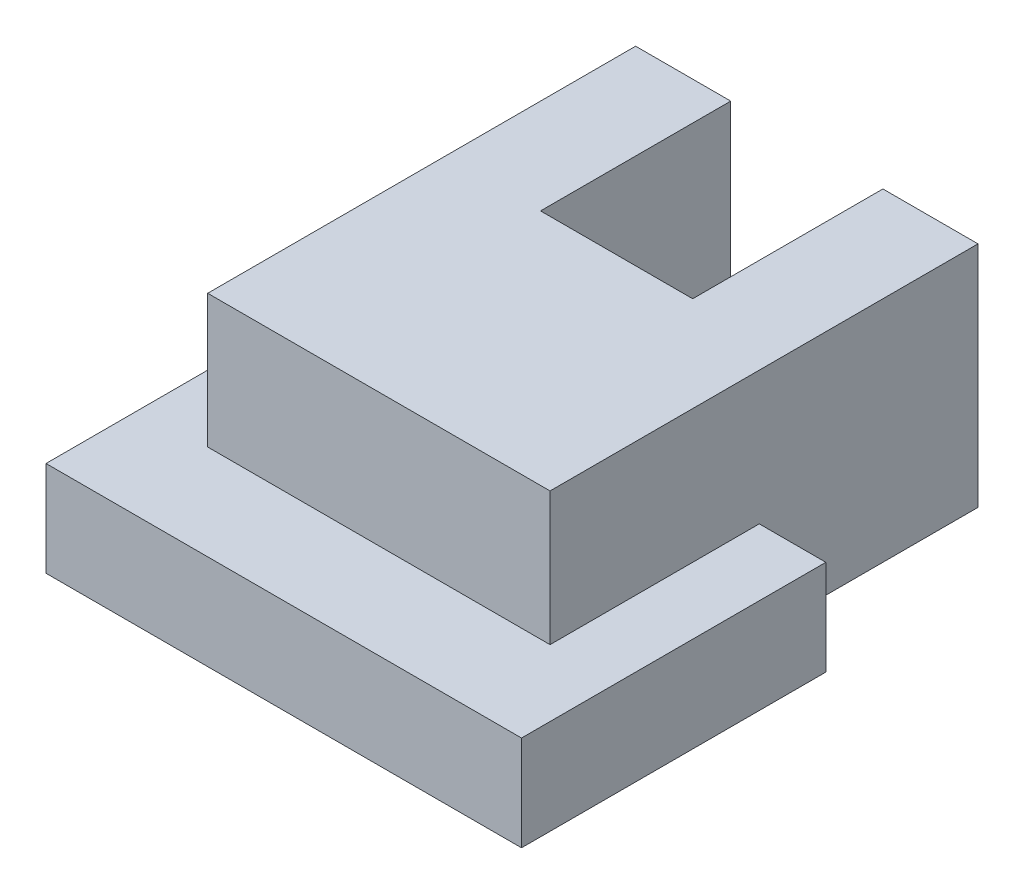
ISO-10303-21;
HEADER;
FILE_DESCRIPTION(('STEP AP214'),'2;1');
FILE_NAME('part.step','',(''),(''),'','','');
FILE_SCHEMA(('AUTOMOTIVE_DESIGN { 1 0 10303 214 1 1 1 1 }'));
ENDSEC;
DATA;
#1=APPLICATION_CONTEXT('core data for automotive mechanical design processes');
#2=APPLICATION_PROTOCOL_DEFINITION('international standard','automotive_design',2000,#1);
#3=PRODUCT_CONTEXT('',#1,'mechanical');
#4=PRODUCT('Part','Part','',(#3));
#5=PRODUCT_RELATED_PRODUCT_CATEGORY('part','',(#4));
#6=PRODUCT_DEFINITION_FORMATION('','',#4);
#7=PRODUCT_DEFINITION_CONTEXT('part definition',#1,'design');
#8=PRODUCT_DEFINITION('design','',#6,#7);
#9=PRODUCT_DEFINITION_SHAPE('','',#8);
#10=(LENGTH_UNIT() NAMED_UNIT(*) SI_UNIT(.MILLI.,.METRE.));
#11=(NAMED_UNIT(*) PLANE_ANGLE_UNIT() SI_UNIT($,.RADIAN.));
#12=(NAMED_UNIT(*) SI_UNIT($,.STERADIAN.) SOLID_ANGLE_UNIT());
#13=UNCERTAINTY_MEASURE_WITH_UNIT(LENGTH_MEASURE(1.E-05),#10,'distance_accuracy_value','');
#14=(GEOMETRIC_REPRESENTATION_CONTEXT(3) GLOBAL_UNCERTAINTY_ASSIGNED_CONTEXT((#13)) GLOBAL_UNIT_ASSIGNED_CONTEXT((#10,
#11,#12)) REPRESENTATION_CONTEXT('',''));
#15=CARTESIAN_POINT('',(0.,0.,0.));
#16=DIRECTION('',(0.,0.,1.));
#17=DIRECTION('',(1.,0.,0.));
#18=AXIS2_PLACEMENT_3D('',#15,#16,#17);
#19=CARTESIAN_POINT('',(-25.,10.,-16.));
#20=DIRECTION('',(0.,0.,1.));
#21=DIRECTION('',(1.,0.,0.));
#22=AXIS2_PLACEMENT_3D('',#19,#20,#21);
#23=PLANE('',#22);
#24=DIRECTION('',(-1.,0.,0.));
#25=VECTOR('',#24,1.);
#26=CARTESIAN_POINT('',(-25.,10.,-16.));
#27=LINE('',#26,#25);
#28=CARTESIAN_POINT('',(-18.,10.,-16.));
#29=VERTEX_POINT('',#28);
#30=CARTESIAN_POINT('',(-25.,10.,-16.));
#31=VERTEX_POINT('',#30);
#32=EDGE_CURVE('E230',#29,#31,#27,.T.);
#33=ORIENTED_EDGE('',*,*,#32,.F.);
#34=DIRECTION('',(0.,-1.,0.));
#35=VECTOR('',#34,1.);
#36=CARTESIAN_POINT('',(-18.,10.,-16.));
#37=LINE('',#36,#35);
#38=CARTESIAN_POINT('',(-18.,0.,-16.));
#39=VERTEX_POINT('',#38);
#40=EDGE_CURVE('E224',#29,#39,#37,.T.);
#41=ORIENTED_EDGE('',*,*,#40,.T.);
#42=DIRECTION('',(-1.,0.,0.));
#43=VECTOR('',#42,1.);
#44=CARTESIAN_POINT('',(-25.,0.,-16.));
#45=LINE('',#44,#43);
#46=CARTESIAN_POINT('',(-25.,0.,-16.));
#47=VERTEX_POINT('',#46);
#48=EDGE_CURVE('E238',#39,#47,#45,.T.);
#49=ORIENTED_EDGE('',*,*,#48,.T.);
#50=DIRECTION('',(0.,-1.,0.));
#51=VECTOR('',#50,1.);
#52=CARTESIAN_POINT('',(-25.,10.,-16.));
#53=LINE('',#52,#51);
#54=EDGE_CURVE('E45',#31,#47,#53,.T.);
#55=ORIENTED_EDGE('',*,*,#54,.F.);
#56=EDGE_LOOP('',(#33,#41,#49,#55));
#57=FACE_BOUND('',#56,.T.);
#58=ADVANCED_FACE('F37',(#57),#23,.F.);
#59=CARTESIAN_POINT('',(25.,10.,16.));
#60=DIRECTION('',(-1.,0.,0.));
#61=DIRECTION('',(0.,0.,1.));
#62=AXIS2_PLACEMENT_3D('',#59,#60,#61);
#63=PLANE('',#62);
#64=DIRECTION('',(0.,0.,-1.));
#65=VECTOR('',#64,1.);
#66=CARTESIAN_POINT('',(25.,0.,16.));
#67=LINE('',#66,#65);
#68=CARTESIAN_POINT('',(25.,0.,16.));
#69=VERTEX_POINT('',#68);
#70=CARTESIAN_POINT('',(25.,0.,-16.));
#71=VERTEX_POINT('',#70);
#72=EDGE_CURVE('E227',#69,#71,#67,.T.);
#73=ORIENTED_EDGE('',*,*,#72,.T.);
#74=DIRECTION('',(0.,-1.,0.));
#75=VECTOR('',#74,1.);
#76=CARTESIAN_POINT('',(25.,10.,-16.));
#77=LINE('',#76,#75);
#78=CARTESIAN_POINT('',(25.,10.,-16.));
#79=VERTEX_POINT('',#78);
#80=EDGE_CURVE('E11',#79,#71,#77,.T.);
#81=ORIENTED_EDGE('',*,*,#80,.F.);
#82=DIRECTION('',(0.,0.,-1.));
#83=VECTOR('',#82,1.);
#84=CARTESIAN_POINT('',(25.,10.,16.));
#85=LINE('',#84,#83);
#86=CARTESIAN_POINT('',(25.,10.,16.));
#87=VERTEX_POINT('',#86);
#88=EDGE_CURVE('E228',#87,#79,#85,.T.);
#89=ORIENTED_EDGE('',*,*,#88,.F.);
#90=DIRECTION('',(0.,-1.,0.));
#91=VECTOR('',#90,1.);
#92=CARTESIAN_POINT('',(25.,10.,16.));
#93=LINE('',#92,#91);
#94=EDGE_CURVE('E235',#87,#69,#93,.T.);
#95=ORIENTED_EDGE('',*,*,#94,.T.);
#96=EDGE_LOOP('',(#73,#81,#89,#95));
#97=FACE_BOUND('',#96,.T.);
#98=ADVANCED_FACE('F39',(#97),#63,.F.);
#99=CARTESIAN_POINT('',(18.,0.,-16.));
#100=VERTEX_POINT('',#99);
#101=EDGE_CURVE('E239',#71,#100,#45,.T.);
#102=ORIENTED_EDGE('',*,*,#101,.T.);
#103=DIRECTION('',(0.,1.,0.));
#104=VECTOR('',#103,1.);
#105=CARTESIAN_POINT('',(18.,10.,-16.));
#106=LINE('',#105,#104);
#107=CARTESIAN_POINT('',(18.,10.,-16.));
#108=VERTEX_POINT('',#107);
#109=EDGE_CURVE('E221',#100,#108,#106,.T.);
#110=ORIENTED_EDGE('',*,*,#109,.T.);
#111=EDGE_CURVE('E89',#79,#108,#27,.T.);
#112=ORIENTED_EDGE('',*,*,#111,.F.);
#113=ORIENTED_EDGE('',*,*,#80,.T.);
#114=EDGE_LOOP('',(#102,#110,#112,#113));
#115=FACE_BOUND('',#114,.T.);
#116=ADVANCED_FACE('F274',(#115),#23,.F.);
#117=CARTESIAN_POINT('',(-25.,10.,16.));
#118=DIRECTION('',(1.,0.,0.));
#119=DIRECTION('',(0.,0.,-1.));
#120=AXIS2_PLACEMENT_3D('',#117,#118,#119);
#121=PLANE('',#120);
#122=DIRECTION('',(0.,0.,1.));
#123=VECTOR('',#122,1.);
#124=CARTESIAN_POINT('',(-25.,0.,16.));
#125=LINE('',#124,#123);
#126=CARTESIAN_POINT('',(-25.,0.,16.));
#127=VERTEX_POINT('',#126);
#128=EDGE_CURVE('E242',#47,#127,#125,.T.);
#129=ORIENTED_EDGE('',*,*,#128,.T.);
#130=DIRECTION('',(0.,-1.,0.));
#131=VECTOR('',#130,1.);
#132=CARTESIAN_POINT('',(-25.,10.,16.));
#133=LINE('',#132,#131);
#134=CARTESIAN_POINT('',(-25.,10.,16.));
#135=VERTEX_POINT('',#134);
#136=EDGE_CURVE('E246',#135,#127,#133,.T.);
#137=ORIENTED_EDGE('',*,*,#136,.F.);
#138=DIRECTION('',(0.,0.,1.));
#139=VECTOR('',#138,1.);
#140=CARTESIAN_POINT('',(-25.,10.,16.));
#141=LINE('',#140,#139);
#142=EDGE_CURVE('E232',#31,#135,#141,.T.);
#143=ORIENTED_EDGE('',*,*,#142,.F.);
#144=ORIENTED_EDGE('',*,*,#54,.T.);
#145=EDGE_LOOP('',(#129,#137,#143,#144));
#146=FACE_BOUND('',#145,.T.);
#147=ADVANCED_FACE('F252',(#146),#121,.F.);
#148=CARTESIAN_POINT('',(-25.,10.,16.));
#149=DIRECTION('',(0.,0.,-1.));
#150=DIRECTION('',(-1.,0.,0.));
#151=AXIS2_PLACEMENT_3D('',#148,#149,#150);
#152=PLANE('',#151);
#153=DIRECTION('',(1.,0.,0.));
#154=VECTOR('',#153,1.);
#155=CARTESIAN_POINT('',(-25.,0.,16.));
#156=LINE('',#155,#154);
#157=EDGE_CURVE('E82',#127,#69,#156,.T.);
#158=ORIENTED_EDGE('',*,*,#157,.T.);
#159=ORIENTED_EDGE('',*,*,#94,.F.);
#160=DIRECTION('',(1.,0.,0.));
#161=VECTOR('',#160,1.);
#162=CARTESIAN_POINT('',(-25.,10.,16.));
#163=LINE('',#162,#161);
#164=EDGE_CURVE('E61',#135,#87,#163,.T.);
#165=ORIENTED_EDGE('',*,*,#164,.F.);
#166=ORIENTED_EDGE('',*,*,#136,.T.);
#167=EDGE_LOOP('',(#158,#159,#165,#166));
#168=FACE_BOUND('',#167,.T.);
#169=ADVANCED_FACE('F265',(#168),#152,.F.);
#170=CARTESIAN_POINT('',(0.,10.,0.));
#171=DIRECTION('',(0.,-1.,0.));
#172=DIRECTION('',(0.,0.,-1.));
#173=AXIS2_PLACEMENT_3D('',#170,#171,#172);
#174=PLANE('',#173);
#175=DIRECTION('',(-1.,0.,0.));
#176=VECTOR('',#175,1.);
#177=CARTESIAN_POINT('',(0.,10.,6.));
#178=LINE('',#177,#176);
#179=CARTESIAN_POINT('',(18.,10.,6.));
#180=VERTEX_POINT('',#179);
#181=CARTESIAN_POINT('',(-18.,10.,6.));
#182=VERTEX_POINT('',#181);
#183=EDGE_CURVE('E205',#180,#182,#178,.T.);
#184=ORIENTED_EDGE('',*,*,#183,.T.);
#185=DIRECTION('',(0.,0.,-1.));
#186=VECTOR('',#185,1.);
#187=CARTESIAN_POINT('',(-18.,10.,0.));
#188=LINE('',#187,#186);
#189=EDGE_CURVE('E151',#182,#29,#188,.T.);
#190=ORIENTED_EDGE('',*,*,#189,.T.);
#191=ORIENTED_EDGE('',*,*,#32,.T.);
#192=ORIENTED_EDGE('',*,*,#142,.T.);
#193=ORIENTED_EDGE('',*,*,#164,.T.);
#194=ORIENTED_EDGE('',*,*,#88,.T.);
#195=ORIENTED_EDGE('',*,*,#111,.T.);
#196=DIRECTION('',(0.,0.,1.));
#197=VECTOR('',#196,1.);
#198=CARTESIAN_POINT('',(18.,10.,0.));
#199=LINE('',#198,#197);
#200=EDGE_CURVE('E218',#108,#180,#199,.T.);
#201=ORIENTED_EDGE('',*,*,#200,.T.);
#202=EDGE_LOOP('',(#184,#190,#191,#192,#193,#194,#195,#201));
#203=FACE_BOUND('',#202,.T.);
#204=ADVANCED_FACE('F267',(#203),#174,.F.);
#205=CARTESIAN_POINT('',(0.,0.,0.));
#206=DIRECTION('',(0.,-1.,0.));
#207=DIRECTION('',(0.,0.,-1.));
#208=AXIS2_PLACEMENT_3D('',#205,#206,#207);
#209=PLANE('',#208);
#210=ORIENTED_EDGE('',*,*,#48,.F.);
#211=DIRECTION('',(0.,0.,1.));
#212=VECTOR('',#211,1.);
#213=CARTESIAN_POINT('',(-18.,0.,6.));
#214=LINE('',#213,#212);
#215=CARTESIAN_POINT('',(-18.,0.,-39.));
#216=VERTEX_POINT('',#215);
#217=EDGE_CURVE('E185',#216,#39,#214,.T.);
#218=ORIENTED_EDGE('',*,*,#217,.F.);
#219=DIRECTION('',(-1.,0.,0.));
#220=VECTOR('',#219,1.);
#221=CARTESIAN_POINT('',(-18.,0.,-39.));
#222=LINE('',#221,#220);
#223=CARTESIAN_POINT('',(-7.99999999999999,0.,-39.));
#224=VERTEX_POINT('',#223);
#225=EDGE_CURVE('E154',#224,#216,#222,.T.);
#226=ORIENTED_EDGE('',*,*,#225,.F.);
#227=DIRECTION('',(0.,0.,-1.));
#228=VECTOR('',#227,1.);
#229=CARTESIAN_POINT('',(-7.99999999999999,0.,-39.));
#230=LINE('',#229,#228);
#231=CARTESIAN_POINT('',(-8.,0.,-19.));
#232=VERTEX_POINT('',#231);
#233=EDGE_CURVE('E198',#232,#224,#230,.T.);
#234=ORIENTED_EDGE('',*,*,#233,.F.);
#235=DIRECTION('',(-1.,0.,0.));
#236=VECTOR('',#235,1.);
#237=CARTESIAN_POINT('',(-8.,0.,-19.));
#238=LINE('',#237,#236);
#239=CARTESIAN_POINT('',(8.,0.,-19.));
#240=VERTEX_POINT('',#239);
#241=EDGE_CURVE('E195',#240,#232,#238,.T.);
#242=ORIENTED_EDGE('',*,*,#241,.F.);
#243=DIRECTION('',(0.,0.,1.));
#244=VECTOR('',#243,1.);
#245=CARTESIAN_POINT('',(7.99999999999999,0.,-39.));
#246=LINE('',#245,#244);
#247=CARTESIAN_POINT('',(7.99999999999999,0.,-39.));
#248=VERTEX_POINT('',#247);
#249=EDGE_CURVE('E192',#248,#240,#246,.T.);
#250=ORIENTED_EDGE('',*,*,#249,.F.);
#251=DIRECTION('',(-1.,0.,0.));
#252=VECTOR('',#251,1.);
#253=CARTESIAN_POINT('',(7.99999999999999,0.,-39.));
#254=LINE('',#253,#252);
#255=CARTESIAN_POINT('',(18.,0.,-39.));
#256=VERTEX_POINT('',#255);
#257=EDGE_CURVE('E189',#256,#248,#254,.T.);
#258=ORIENTED_EDGE('',*,*,#257,.F.);
#259=DIRECTION('',(0.,0.,-1.));
#260=VECTOR('',#259,1.);
#261=CARTESIAN_POINT('',(18.,0.,6.));
#262=LINE('',#261,#260);
#263=EDGE_CURVE('E187',#100,#256,#262,.T.);
#264=ORIENTED_EDGE('',*,*,#263,.F.);
#265=ORIENTED_EDGE('',*,*,#101,.F.);
#266=ORIENTED_EDGE('',*,*,#72,.F.);
#267=ORIENTED_EDGE('',*,*,#157,.F.);
#268=ORIENTED_EDGE('',*,*,#128,.F.);
#269=EDGE_LOOP('',(#210,#218,#226,#234,#242,#250,#258,#264,#265,#266,#267,#268));
#270=FACE_BOUND('',#269,.T.);
#271=ADVANCED_FACE('F258',(#270),#209,.T.);
#272=CARTESIAN_POINT('',(-18.,0.,6.));
#273=DIRECTION('',(-1.,0.,0.));
#274=DIRECTION('',(0.,0.,1.));
#275=AXIS2_PLACEMENT_3D('',#272,#273,#274);
#276=PLANE('',#275);
#277=ORIENTED_EDGE('',*,*,#40,.F.);
#278=ORIENTED_EDGE('',*,*,#189,.F.);
#279=DIRECTION('',(0.,1.,0.));
#280=VECTOR('',#279,1.);
#281=CARTESIAN_POINT('',(-18.,0.,6.));
#282=LINE('',#281,#280);
#283=CARTESIAN_POINT('',(-18.,24.,6.));
#284=VERTEX_POINT('',#283);
#285=EDGE_CURVE('E52',#182,#284,#282,.T.);
#286=ORIENTED_EDGE('',*,*,#285,.T.);
#287=DIRECTION('',(0.,0.,1.));
#288=VECTOR('',#287,1.);
#289=CARTESIAN_POINT('',(-18.,24.,6.));
#290=LINE('',#289,#288);
#291=CARTESIAN_POINT('',(-18.,24.,-39.));
#292=VERTEX_POINT('',#291);
#293=EDGE_CURVE('E149',#292,#284,#290,.T.);
#294=ORIENTED_EDGE('',*,*,#293,.F.);
#295=DIRECTION('',(0.,1.,0.));
#296=VECTOR('',#295,1.);
#297=CARTESIAN_POINT('',(-18.,0.,-39.));
#298=LINE('',#297,#296);
#299=EDGE_CURVE('E203',#216,#292,#298,.T.);
#300=ORIENTED_EDGE('',*,*,#299,.F.);
#301=ORIENTED_EDGE('',*,*,#217,.T.);
#302=EDGE_LOOP('',(#277,#278,#286,#294,#300,#301));
#303=FACE_BOUND('',#302,.T.);
#304=ADVANCED_FACE('F147',(#303),#276,.T.);
#305=CARTESIAN_POINT('',(18.,0.,6.));
#306=DIRECTION('',(1.,0.,0.));
#307=DIRECTION('',(0.,0.,-1.));
#308=AXIS2_PLACEMENT_3D('',#305,#306,#307);
#309=PLANE('',#308);
#310=ORIENTED_EDGE('',*,*,#109,.F.);
#311=ORIENTED_EDGE('',*,*,#263,.T.);
#312=DIRECTION('',(0.,1.,0.));
#313=VECTOR('',#312,1.);
#314=CARTESIAN_POINT('',(18.,0.,-39.));
#315=LINE('',#314,#313);
#316=CARTESIAN_POINT('',(18.,24.,-39.));
#317=VERTEX_POINT('',#316);
#318=EDGE_CURVE('E214',#256,#317,#315,.T.);
#319=ORIENTED_EDGE('',*,*,#318,.T.);
#320=DIRECTION('',(0.,0.,-1.));
#321=VECTOR('',#320,1.);
#322=CARTESIAN_POINT('',(18.,24.,6.));
#323=LINE('',#322,#321);
#324=CARTESIAN_POINT('',(18.,24.,6.));
#325=VERTEX_POINT('',#324);
#326=EDGE_CURVE('E163',#325,#317,#323,.T.);
#327=ORIENTED_EDGE('',*,*,#326,.F.);
#328=DIRECTION('',(0.,1.,0.));
#329=VECTOR('',#328,1.);
#330=CARTESIAN_POINT('',(18.,0.,6.));
#331=LINE('',#330,#329);
#332=EDGE_CURVE('E153',#180,#325,#331,.T.);
#333=ORIENTED_EDGE('',*,*,#332,.F.);
#334=ORIENTED_EDGE('',*,*,#200,.F.);
#335=EDGE_LOOP('',(#310,#311,#319,#327,#333,#334));
#336=FACE_BOUND('',#335,.T.);
#337=ADVANCED_FACE('F285',(#336),#309,.T.);
#338=CARTESIAN_POINT('',(-18.,0.,6.));
#339=DIRECTION('',(0.,0.,1.));
#340=DIRECTION('',(1.,0.,0.));
#341=AXIS2_PLACEMENT_3D('',#338,#339,#340);
#342=PLANE('',#341);
#343=ORIENTED_EDGE('',*,*,#183,.F.);
#344=ORIENTED_EDGE('',*,*,#332,.T.);
#345=DIRECTION('',(1.,0.,0.));
#346=VECTOR('',#345,1.);
#347=CARTESIAN_POINT('',(-18.,24.,6.));
#348=LINE('',#347,#346);
#349=EDGE_CURVE('E157',#284,#325,#348,.T.);
#350=ORIENTED_EDGE('',*,*,#349,.F.);
#351=ORIENTED_EDGE('',*,*,#285,.F.);
#352=EDGE_LOOP('',(#343,#344,#350,#351));
#353=FACE_BOUND('',#352,.T.);
#354=ADVANCED_FACE('F158',(#353),#342,.T.);
#355=CARTESIAN_POINT('',(-18.,0.,-39.));
#356=DIRECTION('',(0.,0.,-1.));
#357=DIRECTION('',(-1.,0.,0.));
#358=AXIS2_PLACEMENT_3D('',#355,#356,#357);
#359=PLANE('',#358);
#360=ORIENTED_EDGE('',*,*,#299,.T.);
#361=DIRECTION('',(-1.,0.,0.));
#362=VECTOR('',#361,1.);
#363=CARTESIAN_POINT('',(-18.,24.,-39.));
#364=LINE('',#363,#362);
#365=CARTESIAN_POINT('',(-7.99999999999999,24.,-39.));
#366=VERTEX_POINT('',#365);
#367=EDGE_CURVE('E169',#366,#292,#364,.T.);
#368=ORIENTED_EDGE('',*,*,#367,.F.);
#369=DIRECTION('',(0.,1.,0.));
#370=VECTOR('',#369,1.);
#371=CARTESIAN_POINT('',(-7.99999999999999,0.,-39.));
#372=LINE('',#371,#370);
#373=EDGE_CURVE('E206',#224,#366,#372,.T.);
#374=ORIENTED_EDGE('',*,*,#373,.F.);
#375=ORIENTED_EDGE('',*,*,#225,.T.);
#376=EDGE_LOOP('',(#360,#368,#374,#375));
#377=FACE_BOUND('',#376,.T.);
#378=ADVANCED_FACE('F305',(#377),#359,.T.);
#379=CARTESIAN_POINT('',(-7.99999999999999,0.,-39.));
#380=DIRECTION('',(1.,0.,0.));
#381=DIRECTION('',(0.,0.,-1.));
#382=AXIS2_PLACEMENT_3D('',#379,#380,#381);
#383=PLANE('',#382);
#384=ORIENTED_EDGE('',*,*,#373,.T.);
#385=DIRECTION('',(0.,0.,-1.));
#386=VECTOR('',#385,1.);
#387=CARTESIAN_POINT('',(-7.99999999999999,24.,-39.));
#388=LINE('',#387,#386);
#389=CARTESIAN_POINT('',(-8.,24.,-19.));
#390=VERTEX_POINT('',#389);
#391=EDGE_CURVE('E182',#390,#366,#388,.T.);
#392=ORIENTED_EDGE('',*,*,#391,.F.);
#393=DIRECTION('',(0.,1.,0.));
#394=VECTOR('',#393,1.);
#395=CARTESIAN_POINT('',(-8.,0.,-19.));
#396=LINE('',#395,#394);
#397=EDGE_CURVE('E208',#232,#390,#396,.T.);
#398=ORIENTED_EDGE('',*,*,#397,.F.);
#399=ORIENTED_EDGE('',*,*,#233,.T.);
#400=EDGE_LOOP('',(#384,#392,#398,#399));
#401=FACE_BOUND('',#400,.T.);
#402=ADVANCED_FACE('F303',(#401),#383,.T.);
#403=CARTESIAN_POINT('',(-8.,0.,-19.));
#404=DIRECTION('',(0.,0.,-1.));
#405=DIRECTION('',(-1.,0.,0.));
#406=AXIS2_PLACEMENT_3D('',#403,#404,#405);
#407=PLANE('',#406);
#408=ORIENTED_EDGE('',*,*,#397,.T.);
#409=DIRECTION('',(-1.,0.,0.));
#410=VECTOR('',#409,1.);
#411=CARTESIAN_POINT('',(-8.,24.,-19.));
#412=LINE('',#411,#410);
#413=CARTESIAN_POINT('',(8.,24.,-19.));
#414=VERTEX_POINT('',#413);
#415=EDGE_CURVE('E179',#414,#390,#412,.T.);
#416=ORIENTED_EDGE('',*,*,#415,.F.);
#417=DIRECTION('',(0.,1.,0.));
#418=VECTOR('',#417,1.);
#419=CARTESIAN_POINT('',(8.,0.,-19.));
#420=LINE('',#419,#418);
#421=EDGE_CURVE('E210',#240,#414,#420,.T.);
#422=ORIENTED_EDGE('',*,*,#421,.F.);
#423=ORIENTED_EDGE('',*,*,#241,.T.);
#424=EDGE_LOOP('',(#408,#416,#422,#423));
#425=FACE_BOUND('',#424,.T.);
#426=ADVANCED_FACE('F299',(#425),#407,.T.);
#427=CARTESIAN_POINT('',(7.99999999999999,0.,-39.));
#428=DIRECTION('',(-1.,0.,0.));
#429=DIRECTION('',(0.,0.,1.));
#430=AXIS2_PLACEMENT_3D('',#427,#428,#429);
#431=PLANE('',#430);
#432=ORIENTED_EDGE('',*,*,#421,.T.);
#433=DIRECTION('',(0.,0.,1.));
#434=VECTOR('',#433,1.);
#435=CARTESIAN_POINT('',(7.99999999999999,24.,-39.));
#436=LINE('',#435,#434);
#437=CARTESIAN_POINT('',(7.99999999999999,24.,-39.));
#438=VERTEX_POINT('',#437);
#439=EDGE_CURVE('E176',#438,#414,#436,.T.);
#440=ORIENTED_EDGE('',*,*,#439,.F.);
#441=DIRECTION('',(0.,1.,0.));
#442=VECTOR('',#441,1.);
#443=CARTESIAN_POINT('',(7.99999999999999,0.,-39.));
#444=LINE('',#443,#442);
#445=EDGE_CURVE('E212',#248,#438,#444,.T.);
#446=ORIENTED_EDGE('',*,*,#445,.F.);
#447=ORIENTED_EDGE('',*,*,#249,.T.);
#448=EDGE_LOOP('',(#432,#440,#446,#447));
#449=FACE_BOUND('',#448,.T.);
#450=ADVANCED_FACE('F294',(#449),#431,.T.);
#451=CARTESIAN_POINT('',(7.99999999999999,0.,-39.));
#452=DIRECTION('',(0.,0.,-1.));
#453=DIRECTION('',(-1.,0.,0.));
#454=AXIS2_PLACEMENT_3D('',#451,#452,#453);
#455=PLANE('',#454);
#456=ORIENTED_EDGE('',*,*,#445,.T.);
#457=DIRECTION('',(-1.,0.,0.));
#458=VECTOR('',#457,1.);
#459=CARTESIAN_POINT('',(7.99999999999999,24.,-39.));
#460=LINE('',#459,#458);
#461=EDGE_CURVE('E173',#317,#438,#460,.T.);
#462=ORIENTED_EDGE('',*,*,#461,.F.);
#463=ORIENTED_EDGE('',*,*,#318,.F.);
#464=ORIENTED_EDGE('',*,*,#257,.T.);
#465=EDGE_LOOP('',(#456,#462,#463,#464));
#466=FACE_BOUND('',#465,.T.);
#467=ADVANCED_FACE('F290',(#466),#455,.T.);
#468=CARTESIAN_POINT('',(0.,24.,0.));
#469=DIRECTION('',(0.,-1.,0.));
#470=DIRECTION('',(0.,0.,-1.));
#471=AXIS2_PLACEMENT_3D('',#468,#469,#470);
#472=PLANE('',#471);
#473=ORIENTED_EDGE('',*,*,#293,.T.);
#474=ORIENTED_EDGE('',*,*,#349,.T.);
#475=ORIENTED_EDGE('',*,*,#326,.T.);
#476=ORIENTED_EDGE('',*,*,#461,.T.);
#477=ORIENTED_EDGE('',*,*,#439,.T.);
#478=ORIENTED_EDGE('',*,*,#415,.T.);
#479=ORIENTED_EDGE('',*,*,#391,.T.);
#480=ORIENTED_EDGE('',*,*,#367,.T.);
#481=EDGE_LOOP('',(#473,#474,#475,#476,#477,#478,#479,#480));
#482=FACE_BOUND('',#481,.T.);
#483=ADVANCED_FACE('F166',(#482),#472,.F.);
#484=CLOSED_SHELL('',(#58,#98,#116,#147,#169,#204,#271,#304,#337,#354,#378,#402,#426,#450,#467,#483));
#485=MANIFOLD_SOLID_BREP('B2',#484);
#486=ADVANCED_BREP_SHAPE_REPRESENTATION('',(#18,#485),#14);
#487=SHAPE_DEFINITION_REPRESENTATION(#9,#486);
ENDSEC;
END-ISO-10303-21;
